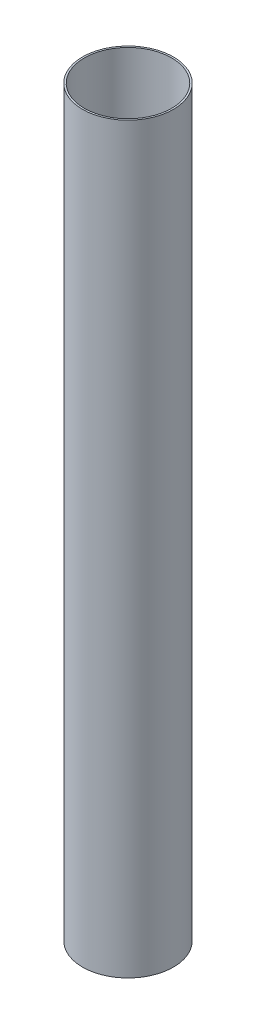
ISO-10303-21;
HEADER;
FILE_DESCRIPTION(('STEP AP214'),'2;1');
FILE_NAME('part.step','',(''),(''),'','','');
FILE_SCHEMA(('AUTOMOTIVE_DESIGN { 1 0 10303 214 1 1 1 1 }'));
ENDSEC;
DATA;
#1=APPLICATION_CONTEXT('core data for automotive mechanical design processes');
#2=APPLICATION_PROTOCOL_DEFINITION('international standard','automotive_design',2000,#1);
#3=PRODUCT_CONTEXT('',#1,'mechanical');
#4=PRODUCT('Part','Part','',(#3));
#5=PRODUCT_RELATED_PRODUCT_CATEGORY('part','',(#4));
#6=PRODUCT_DEFINITION_FORMATION('','',#4);
#7=PRODUCT_DEFINITION_CONTEXT('part definition',#1,'design');
#8=PRODUCT_DEFINITION('design','',#6,#7);
#9=PRODUCT_DEFINITION_SHAPE('','',#8);
#10=(LENGTH_UNIT() NAMED_UNIT(*) SI_UNIT(.MILLI.,.METRE.));
#11=(NAMED_UNIT(*) PLANE_ANGLE_UNIT() SI_UNIT($,.RADIAN.));
#12=(NAMED_UNIT(*) SI_UNIT($,.STERADIAN.) SOLID_ANGLE_UNIT());
#13=UNCERTAINTY_MEASURE_WITH_UNIT(LENGTH_MEASURE(1.E-05),#10,'distance_accuracy_value','');
#14=(GEOMETRIC_REPRESENTATION_CONTEXT(3) GLOBAL_UNCERTAINTY_ASSIGNED_CONTEXT((#13)) GLOBAL_UNIT_ASSIGNED_CONTEXT((#10,
#11,#12)) REPRESENTATION_CONTEXT('',''));
#15=CARTESIAN_POINT('',(0.,0.,0.));
#16=DIRECTION('',(0.,0.,1.));
#17=DIRECTION('',(1.,0.,0.));
#18=AXIS2_PLACEMENT_3D('',#15,#16,#17);
#19=CARTESIAN_POINT('',(0.,647.7,0.));
#20=DIRECTION('',(0.,-1.,0.));
#21=DIRECTION('',(0.,0.,-1.));
#22=AXIS2_PLACEMENT_3D('',#19,#20,#21);
#23=CYLINDRICAL_SURFACE('',#22,38.1);
#24=CARTESIAN_POINT('',(0.,647.7,0.));
#25=DIRECTION('',(0.,1.,0.));
#26=DIRECTION('',(0.,0.,1.));
#27=AXIS2_PLACEMENT_3D('',#24,#25,#26);
#28=CIRCLE('',#27,38.1);
#29=CARTESIAN_POINT('',(0.,647.7,38.1));
#30=VERTEX_POINT('',#29);
#31=EDGE_CURVE('E45',#30,#30,#28,.T.);
#32=ORIENTED_EDGE('',*,*,#31,.T.);
#33=EDGE_LOOP('',(#32));
#34=FACE_BOUND('',#33,.T.);
#35=CARTESIAN_POINT('',(0.,0.,0.));
#36=DIRECTION('',(0.,1.,0.));
#37=DIRECTION('',(0.,0.,1.));
#38=AXIS2_PLACEMENT_3D('',#35,#36,#37);
#39=CIRCLE('',#38,38.1);
#40=CARTESIAN_POINT('',(0.,0.,38.1));
#41=VERTEX_POINT('',#40);
#42=EDGE_CURVE('E52',#41,#41,#39,.T.);
#43=ORIENTED_EDGE('',*,*,#42,.F.);
#44=EDGE_LOOP('',(#43));
#45=FACE_BOUND('',#44,.T.);
#46=ADVANCED_FACE('F37',(#34,#45),#23,.F.);
#47=CARTESIAN_POINT('',(0.,647.7,0.));
#48=DIRECTION('',(0.,-1.,0.));
#49=DIRECTION('',(0.,0.,-1.));
#50=AXIS2_PLACEMENT_3D('',#47,#48,#49);
#51=CYLINDRICAL_SURFACE('',#50,39.624);
#52=CARTESIAN_POINT('',(0.,647.7,0.));
#53=DIRECTION('',(0.,1.,0.));
#54=DIRECTION('',(0.,0.,1.));
#55=AXIS2_PLACEMENT_3D('',#52,#53,#54);
#56=CIRCLE('',#55,39.624);
#57=CARTESIAN_POINT('',(0.,647.7,39.624));
#58=VERTEX_POINT('',#57);
#59=EDGE_CURVE('E10',#58,#58,#56,.T.);
#60=ORIENTED_EDGE('',*,*,#59,.F.);
#61=EDGE_LOOP('',(#60));
#62=FACE_BOUND('',#61,.T.);
#63=CARTESIAN_POINT('',(0.,0.,0.));
#64=DIRECTION('',(0.,1.,0.));
#65=DIRECTION('',(0.,0.,1.));
#66=AXIS2_PLACEMENT_3D('',#63,#64,#65);
#67=CIRCLE('',#66,39.624);
#68=CARTESIAN_POINT('',(0.,0.,39.624));
#69=VERTEX_POINT('',#68);
#70=EDGE_CURVE('E40',#69,#69,#67,.T.);
#71=ORIENTED_EDGE('',*,*,#70,.T.);
#72=EDGE_LOOP('',(#71));
#73=FACE_BOUND('',#72,.T.);
#74=ADVANCED_FACE('F61',(#62,#73),#51,.T.);
#75=CARTESIAN_POINT('',(0.,647.7,0.));
#76=DIRECTION('',(0.,1.,0.));
#77=DIRECTION('',(0.,0.,1.));
#78=AXIS2_PLACEMENT_3D('',#75,#76,#77);
#79=PLANE('',#78);
#80=ORIENTED_EDGE('',*,*,#31,.F.);
#81=EDGE_LOOP('',(#80));
#82=FACE_BOUND('',#81,.T.);
#83=ORIENTED_EDGE('',*,*,#59,.T.);
#84=EDGE_LOOP('',(#83));
#85=FACE_BOUND('',#84,.T.);
#86=ADVANCED_FACE('F65',(#82,#85),#79,.T.);
#87=CARTESIAN_POINT('',(0.,0.,0.));
#88=DIRECTION('',(0.,1.,0.));
#89=DIRECTION('',(0.,0.,1.));
#90=AXIS2_PLACEMENT_3D('',#87,#88,#89);
#91=PLANE('',#90);
#92=ORIENTED_EDGE('',*,*,#42,.T.);
#93=EDGE_LOOP('',(#92));
#94=FACE_BOUND('',#93,.T.);
#95=ORIENTED_EDGE('',*,*,#70,.F.);
#96=EDGE_LOOP('',(#95));
#97=FACE_BOUND('',#96,.T.);
#98=ADVANCED_FACE('F63',(#94,#97),#91,.F.);
#99=CLOSED_SHELL('',(#46,#74,#86,#98));
#100=MANIFOLD_SOLID_BREP('B2',#99);
#101=ADVANCED_BREP_SHAPE_REPRESENTATION('',(#18,#100),#14);
#102=SHAPE_DEFINITION_REPRESENTATION(#9,#101);
ENDSEC;
END-ISO-10303-21;
